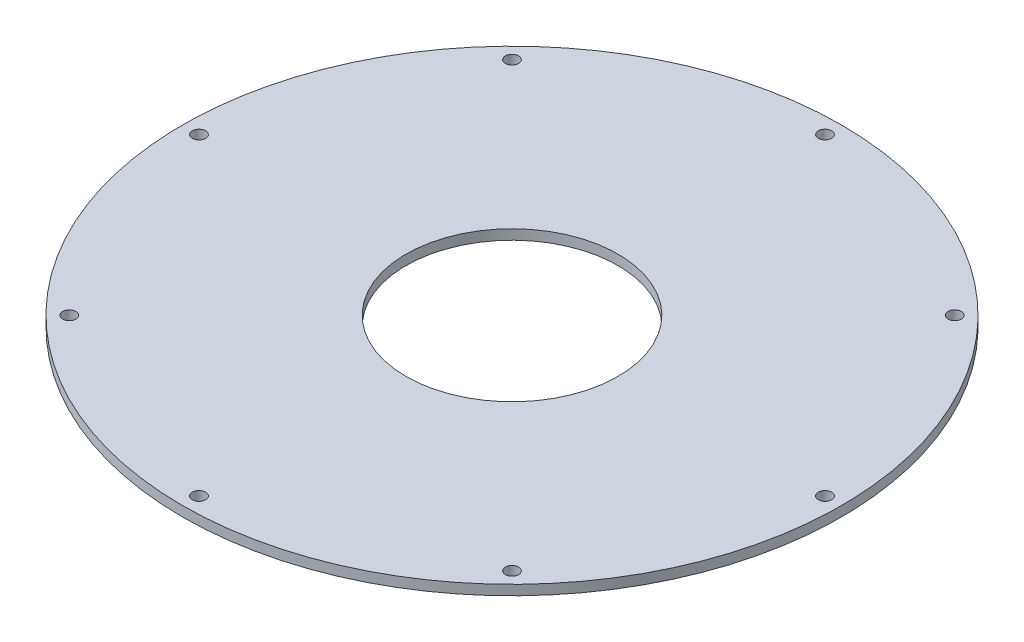
ISO-10303-21;
HEADER;
FILE_DESCRIPTION(('STEP AP214'),'2;1');
FILE_NAME('part.step','',(''),(''),'','','');
FILE_SCHEMA(('AUTOMOTIVE_DESIGN { 1 0 10303 214 1 1 1 1 }'));
ENDSEC;
DATA;
#1=APPLICATION_CONTEXT('core data for automotive mechanical design processes');
#2=APPLICATION_PROTOCOL_DEFINITION('international standard','automotive_design',2000,#1);
#3=PRODUCT_CONTEXT('',#1,'mechanical');
#4=PRODUCT('Part','Part','',(#3));
#5=PRODUCT_RELATED_PRODUCT_CATEGORY('part','',(#4));
#6=PRODUCT_DEFINITION_FORMATION('','',#4);
#7=PRODUCT_DEFINITION_CONTEXT('part definition',#1,'design');
#8=PRODUCT_DEFINITION('design','',#6,#7);
#9=PRODUCT_DEFINITION_SHAPE('','',#8);
#10=(LENGTH_UNIT() NAMED_UNIT(*) SI_UNIT(.MILLI.,.METRE.));
#11=(NAMED_UNIT(*) PLANE_ANGLE_UNIT() SI_UNIT($,.RADIAN.));
#12=(NAMED_UNIT(*) SI_UNIT($,.STERADIAN.) SOLID_ANGLE_UNIT());
#13=UNCERTAINTY_MEASURE_WITH_UNIT(LENGTH_MEASURE(1.E-05),#10,'distance_accuracy_value','');
#14=(GEOMETRIC_REPRESENTATION_CONTEXT(3) GLOBAL_UNCERTAINTY_ASSIGNED_CONTEXT((#13)) GLOBAL_UNIT_ASSIGNED_CONTEXT((#10,
#11,#12)) REPRESENTATION_CONTEXT('',''));
#15=CARTESIAN_POINT('',(0.,0.,0.));
#16=DIRECTION('',(0.,0.,1.));
#17=DIRECTION('',(1.,0.,0.));
#18=AXIS2_PLACEMENT_3D('',#15,#16,#17);
#19=CARTESIAN_POINT('',(0.,1.5,0.));
#20=DIRECTION('',(0.,1.,0.));
#21=DIRECTION('',(0.,0.,1.));
#22=AXIS2_PLACEMENT_3D('',#19,#20,#21);
#23=PLANE('',#22);
#24=CARTESIAN_POINT('',(-94.5,1.5,3.29944986520676E-13));
#25=DIRECTION('',(0.,1.,0.));
#26=DIRECTION('',(1.,0.,0.));
#27=AXIS2_PLACEMENT_3D('',#24,#25,#26);
#28=CIRCLE('',#27,2.);
#29=CARTESIAN_POINT('',(-92.5,1.5,3.2296202384299E-13));
#30=VERTEX_POINT('',#29);
#31=EDGE_CURVE('E85',#30,#30,#28,.T.);
#32=ORIENTED_EDGE('',*,*,#31,.F.);
#33=EDGE_LOOP('',(#32));
#34=FACE_BOUND('',#33,.T.);
#35=CARTESIAN_POINT('',(-66.8215908221284,1.5,66.8215908221291));
#36=DIRECTION('',(0.,1.,0.));
#37=DIRECTION('',(0.707106781186544,0.,-0.707106781186551));
#38=AXIS2_PLACEMENT_3D('',#35,#36,#37);
#39=CIRCLE('',#38,2.);
#40=CARTESIAN_POINT('',(-65.4073772597553,1.5,65.407377259756));
#41=VERTEX_POINT('',#40);
#42=EDGE_CURVE('E79',#41,#41,#39,.T.);
#43=ORIENTED_EDGE('',*,*,#42,.F.);
#44=EDGE_LOOP('',(#43));
#45=FACE_BOUND('',#44,.T.);
#46=CARTESIAN_POINT('',(0.,1.5,94.5));
#47=DIRECTION('',(0.,1.,0.));
#48=DIRECTION('',(0.,0.,-1.));
#49=AXIS2_PLACEMENT_3D('',#46,#47,#48);
#50=CIRCLE('',#49,2.);
#51=CARTESIAN_POINT('',(0.,1.5,92.5));
#52=VERTEX_POINT('',#51);
#53=EDGE_CURVE('E73',#52,#52,#50,.T.);
#54=ORIENTED_EDGE('',*,*,#53,.F.);
#55=EDGE_LOOP('',(#54));
#56=FACE_BOUND('',#55,.T.);
#57=CARTESIAN_POINT('',(66.8215908221293,1.5,66.8215908221282));
#58=DIRECTION('',(0.,1.,0.));
#59=DIRECTION('',(-0.707106781186554,0.,-0.707106781186541));
#60=AXIS2_PLACEMENT_3D('',#57,#58,#59);
#61=CIRCLE('',#60,2.);
#62=CARTESIAN_POINT('',(65.4073772597562,1.5,65.4073772597551));
#63=VERTEX_POINT('',#62);
#64=EDGE_CURVE('E66',#63,#63,#61,.T.);
#65=ORIENTED_EDGE('',*,*,#64,.F.);
#66=EDGE_LOOP('',(#65));
#67=FACE_BOUND('',#66,.T.);
#68=CARTESIAN_POINT('',(94.5,1.5,-9.89834959562028E-13));
#69=DIRECTION('',(0.,1.,0.));
#70=DIRECTION('',(-1.,0.,0.));
#71=AXIS2_PLACEMENT_3D('',#68,#69,#70);
#72=CIRCLE('',#71,2.);
#73=CARTESIAN_POINT('',(92.5,1.5,-9.68886071528969E-13));
#74=VERTEX_POINT('',#73);
#75=EDGE_CURVE('E96',#74,#74,#72,.T.);
#76=ORIENTED_EDGE('',*,*,#75,.F.);
#77=EDGE_LOOP('',(#76));
#78=FACE_BOUND('',#77,.T.);
#79=CARTESIAN_POINT('',(66.8215908221279,1.5,-66.8215908221296));
#80=DIRECTION('',(0.,1.,0.));
#81=DIRECTION('',(-0.707106781186539,0.,0.707106781186556));
#82=AXIS2_PLACEMENT_3D('',#79,#80,#81);
#83=CIRCLE('',#82,2.);
#84=CARTESIAN_POINT('',(65.4073772597549,1.5,-65.4073772597564));
#85=VERTEX_POINT('',#84);
#86=EDGE_CURVE('E90',#85,#85,#83,.T.);
#87=ORIENTED_EDGE('',*,*,#86,.F.);
#88=EDGE_LOOP('',(#87));
#89=FACE_BOUND('',#88,.T.);
#90=CARTESIAN_POINT('',(-66.8215908221289,1.5,-66.8215908221286));
#91=DIRECTION('',(0.,1.,0.));
#92=DIRECTION('',(0.707106781186549,0.,0.707106781186546));
#93=AXIS2_PLACEMENT_3D('',#90,#91,#92);
#94=CIRCLE('',#93,2.);
#95=CARTESIAN_POINT('',(-65.4073772597558,1.5,-65.4073772597555));
#96=VERTEX_POINT('',#95);
#97=EDGE_CURVE('E60',#96,#96,#94,.T.);
#98=ORIENTED_EDGE('',*,*,#97,.F.);
#99=EDGE_LOOP('',(#98));
#100=FACE_BOUND('',#99,.T.);
#101=CARTESIAN_POINT('',(0.,1.5,-94.5));
#102=DIRECTION('',(0.,1.,0.));
#103=DIRECTION('',(0.,0.,1.));
#104=AXIS2_PLACEMENT_3D('',#101,#102,#103);
#105=CIRCLE('',#104,2.);
#106=CARTESIAN_POINT('',(0.,1.5,-92.5));
#107=VERTEX_POINT('',#106);
#108=EDGE_CURVE('E54',#107,#107,#105,.T.);
#109=ORIENTED_EDGE('',*,*,#108,.F.);
#110=EDGE_LOOP('',(#109));
#111=FACE_BOUND('',#110,.T.);
#112=CARTESIAN_POINT('',(0.,1.5,0.));
#113=DIRECTION('',(0.,1.,0.));
#114=DIRECTION('',(0.,0.,1.));
#115=AXIS2_PLACEMENT_3D('',#112,#113,#114);
#116=CIRCLE('',#115,99.5);
#117=CARTESIAN_POINT('',(0.,1.5,99.5));
#118=VERTEX_POINT('',#117);
#119=EDGE_CURVE('E10',#118,#118,#116,.T.);
#120=ORIENTED_EDGE('',*,*,#119,.T.);
#121=EDGE_LOOP('',(#120));
#122=FACE_BOUND('',#121,.T.);
#123=CARTESIAN_POINT('',(0.,1.5,0.));
#124=DIRECTION('',(0.,1.,0.));
#125=DIRECTION('',(0.,0.,1.));
#126=AXIS2_PLACEMENT_3D('',#123,#124,#125);
#127=CIRCLE('',#126,32.);
#128=CARTESIAN_POINT('',(0.,1.5,32.));
#129=VERTEX_POINT('',#128);
#130=EDGE_CURVE('E46',#129,#129,#127,.T.);
#131=ORIENTED_EDGE('',*,*,#130,.F.);
#132=EDGE_LOOP('',(#131));
#133=FACE_BOUND('',#132,.T.);
#134=ADVANCED_FACE('F35',(#34,#45,#56,#67,#78,#89,#100,#111,#122,#133),#23,.T.);
#135=CARTESIAN_POINT('',(0.,-1.5,0.));
#136=DIRECTION('',(0.,1.,0.));
#137=DIRECTION('',(0.,0.,1.));
#138=AXIS2_PLACEMENT_3D('',#135,#136,#137);
#139=PLANE('',#138);
#140=CARTESIAN_POINT('',(-94.5,-1.5,3.29944986520676E-13));
#141=DIRECTION('',(0.,1.,0.));
#142=DIRECTION('',(1.,0.,0.));
#143=AXIS2_PLACEMENT_3D('',#140,#141,#142);
#144=CIRCLE('',#143,2.);
#145=CARTESIAN_POINT('',(-92.5,-1.5,3.2296202384299E-13));
#146=VERTEX_POINT('',#145);
#147=EDGE_CURVE('E63',#146,#146,#144,.T.);
#148=ORIENTED_EDGE('',*,*,#147,.T.);
#149=EDGE_LOOP('',(#148));
#150=FACE_BOUND('',#149,.T.);
#151=CARTESIAN_POINT('',(-66.8215908221284,-1.5,66.8215908221291));
#152=DIRECTION('',(0.,1.,0.));
#153=DIRECTION('',(0.707106781186544,0.,-0.707106781186551));
#154=AXIS2_PLACEMENT_3D('',#151,#152,#153);
#155=CIRCLE('',#154,2.);
#156=CARTESIAN_POINT('',(-65.4073772597553,-1.5,65.407377259756));
#157=VERTEX_POINT('',#156);
#158=EDGE_CURVE('E82',#157,#157,#155,.T.);
#159=ORIENTED_EDGE('',*,*,#158,.T.);
#160=EDGE_LOOP('',(#159));
#161=FACE_BOUND('',#160,.T.);
#162=CARTESIAN_POINT('',(0.,-1.5,94.5));
#163=DIRECTION('',(0.,1.,0.));
#164=DIRECTION('',(0.,0.,-1.));
#165=AXIS2_PLACEMENT_3D('',#162,#163,#164);
#166=CIRCLE('',#165,2.);
#167=CARTESIAN_POINT('',(0.,-1.5,92.5));
#168=VERTEX_POINT('',#167);
#169=EDGE_CURVE('E76',#168,#168,#166,.T.);
#170=ORIENTED_EDGE('',*,*,#169,.T.);
#171=EDGE_LOOP('',(#170));
#172=FACE_BOUND('',#171,.T.);
#173=CARTESIAN_POINT('',(66.8215908221293,-1.5,66.8215908221282));
#174=DIRECTION('',(0.,1.,0.));
#175=DIRECTION('',(-0.707106781186554,0.,-0.707106781186541));
#176=AXIS2_PLACEMENT_3D('',#173,#174,#175);
#177=CIRCLE('',#176,2.);
#178=CARTESIAN_POINT('',(65.4073772597562,-1.5,65.4073772597551));
#179=VERTEX_POINT('',#178);
#180=EDGE_CURVE('E69',#179,#179,#177,.T.);
#181=ORIENTED_EDGE('',*,*,#180,.T.);
#182=EDGE_LOOP('',(#181));
#183=FACE_BOUND('',#182,.T.);
#184=CARTESIAN_POINT('',(94.5,-1.5,-9.89834959562028E-13));
#185=DIRECTION('',(0.,1.,0.));
#186=DIRECTION('',(-1.,0.,0.));
#187=AXIS2_PLACEMENT_3D('',#184,#185,#186);
#188=CIRCLE('',#187,2.);
#189=CARTESIAN_POINT('',(92.5,-1.5,-9.68886071528969E-13));
#190=VERTEX_POINT('',#189);
#191=EDGE_CURVE('E70',#190,#190,#188,.T.);
#192=ORIENTED_EDGE('',*,*,#191,.T.);
#193=EDGE_LOOP('',(#192));
#194=FACE_BOUND('',#193,.T.);
#195=CARTESIAN_POINT('',(66.8215908221279,-1.5,-66.8215908221296));
#196=DIRECTION('',(0.,1.,0.));
#197=DIRECTION('',(-0.707106781186539,0.,0.707106781186556));
#198=AXIS2_PLACEMENT_3D('',#195,#196,#197);
#199=CIRCLE('',#198,2.);
#200=CARTESIAN_POINT('',(65.4073772597549,-1.5,-65.4073772597564));
#201=VERTEX_POINT('',#200);
#202=EDGE_CURVE('E93',#201,#201,#199,.T.);
#203=ORIENTED_EDGE('',*,*,#202,.T.);
#204=EDGE_LOOP('',(#203));
#205=FACE_BOUND('',#204,.T.);
#206=CARTESIAN_POINT('',(-66.8215908221289,-1.5,-66.8215908221286));
#207=DIRECTION('',(0.,1.,0.));
#208=DIRECTION('',(0.707106781186549,0.,0.707106781186546));
#209=AXIS2_PLACEMENT_3D('',#206,#207,#208);
#210=CIRCLE('',#209,2.);
#211=CARTESIAN_POINT('',(-65.4073772597558,-1.5,-65.4073772597555));
#212=VERTEX_POINT('',#211);
#213=EDGE_CURVE('E57',#212,#212,#210,.T.);
#214=ORIENTED_EDGE('',*,*,#213,.T.);
#215=EDGE_LOOP('',(#214));
#216=FACE_BOUND('',#215,.T.);
#217=CARTESIAN_POINT('',(0.,-1.5,-94.5));
#218=DIRECTION('',(0.,1.,0.));
#219=DIRECTION('',(0.,0.,1.));
#220=AXIS2_PLACEMENT_3D('',#217,#218,#219);
#221=CIRCLE('',#220,2.);
#222=CARTESIAN_POINT('',(0.,-1.5,-92.5));
#223=VERTEX_POINT('',#222);
#224=EDGE_CURVE('E51',#223,#223,#221,.T.);
#225=ORIENTED_EDGE('',*,*,#224,.T.);
#226=EDGE_LOOP('',(#225));
#227=FACE_BOUND('',#226,.T.);
#228=CARTESIAN_POINT('',(0.,-1.5,0.));
#229=DIRECTION('',(0.,1.,0.));
#230=DIRECTION('',(0.,0.,1.));
#231=AXIS2_PLACEMENT_3D('',#228,#229,#230);
#232=CIRCLE('',#231,99.5);
#233=CARTESIAN_POINT('',(0.,-1.5,99.5));
#234=VERTEX_POINT('',#233);
#235=EDGE_CURVE('E39',#234,#234,#232,.T.);
#236=ORIENTED_EDGE('',*,*,#235,.F.);
#237=EDGE_LOOP('',(#236));
#238=FACE_BOUND('',#237,.T.);
#239=CARTESIAN_POINT('',(0.,-1.5,0.));
#240=DIRECTION('',(0.,1.,0.));
#241=DIRECTION('',(0.,0.,1.));
#242=AXIS2_PLACEMENT_3D('',#239,#240,#241);
#243=CIRCLE('',#242,32.);
#244=CARTESIAN_POINT('',(0.,-1.5,32.));
#245=VERTEX_POINT('',#244);
#246=EDGE_CURVE('E48',#245,#245,#243,.T.);
#247=ORIENTED_EDGE('',*,*,#246,.T.);
#248=EDGE_LOOP('',(#247));
#249=FACE_BOUND('',#248,.T.);
#250=ADVANCED_FACE('F102',(#150,#161,#172,#183,#194,#205,#216,#227,#238,#249),#139,.F.);
#251=CARTESIAN_POINT('',(0.,1.5,0.));
#252=DIRECTION('',(0.,-1.,0.));
#253=DIRECTION('',(0.,0.,-1.));
#254=AXIS2_PLACEMENT_3D('',#251,#252,#253);
#255=CYLINDRICAL_SURFACE('',#254,99.5);
#256=ORIENTED_EDGE('',*,*,#119,.F.);
#257=EDGE_LOOP('',(#256));
#258=FACE_BOUND('',#257,.T.);
#259=ORIENTED_EDGE('',*,*,#235,.T.);
#260=EDGE_LOOP('',(#259));
#261=FACE_BOUND('',#260,.T.);
#262=ADVANCED_FACE('F37',(#258,#261),#255,.T.);
#263=CARTESIAN_POINT('',(0.,1.5,0.));
#264=DIRECTION('',(0.,-1.,0.));
#265=DIRECTION('',(0.,0.,-1.));
#266=AXIS2_PLACEMENT_3D('',#263,#264,#265);
#267=CYLINDRICAL_SURFACE('',#266,32.);
#268=ORIENTED_EDGE('',*,*,#130,.T.);
#269=EDGE_LOOP('',(#268));
#270=FACE_BOUND('',#269,.T.);
#271=ORIENTED_EDGE('',*,*,#246,.F.);
#272=EDGE_LOOP('',(#271));
#273=FACE_BOUND('',#272,.T.);
#274=ADVANCED_FACE('F125',(#270,#273),#267,.F.);
#275=CARTESIAN_POINT('',(0.,-1.5,-94.5));
#276=DIRECTION('',(0.,1.,0.));
#277=DIRECTION('',(0.,0.,1.));
#278=AXIS2_PLACEMENT_3D('',#275,#276,#277);
#279=CYLINDRICAL_SURFACE('',#278,2.);
#280=ORIENTED_EDGE('',*,*,#224,.F.);
#281=EDGE_LOOP('',(#280));
#282=FACE_BOUND('',#281,.T.);
#283=ORIENTED_EDGE('',*,*,#108,.T.);
#284=EDGE_LOOP('',(#283));
#285=FACE_BOUND('',#284,.T.);
#286=ADVANCED_FACE('F128',(#282,#285),#279,.F.);
#287=CARTESIAN_POINT('',(-66.8215908221289,-1.5,-66.8215908221286));
#288=DIRECTION('',(0.,1.,0.));
#289=DIRECTION('',(0.,0.,1.));
#290=AXIS2_PLACEMENT_3D('',#287,#288,#289);
#291=CYLINDRICAL_SURFACE('',#290,2.);
#292=ORIENTED_EDGE('',*,*,#213,.F.);
#293=EDGE_LOOP('',(#292));
#294=FACE_BOUND('',#293,.T.);
#295=ORIENTED_EDGE('',*,*,#97,.T.);
#296=EDGE_LOOP('',(#295));
#297=FACE_BOUND('',#296,.T.);
#298=ADVANCED_FACE('F142',(#294,#297),#291,.F.);
#299=CARTESIAN_POINT('',(66.8215908221279,-1.5,-66.8215908221296));
#300=DIRECTION('',(0.,1.,0.));
#301=DIRECTION('',(0.,0.,1.));
#302=AXIS2_PLACEMENT_3D('',#299,#300,#301);
#303=CYLINDRICAL_SURFACE('',#302,2.);
#304=ORIENTED_EDGE('',*,*,#202,.F.);
#305=EDGE_LOOP('',(#304));
#306=FACE_BOUND('',#305,.T.);
#307=ORIENTED_EDGE('',*,*,#86,.T.);
#308=EDGE_LOOP('',(#307));
#309=FACE_BOUND('',#308,.T.);
#310=ADVANCED_FACE('F109',(#306,#309),#303,.F.);
#311=CARTESIAN_POINT('',(94.5,-1.5,-9.89834959562028E-13));
#312=DIRECTION('',(0.,1.,0.));
#313=DIRECTION('',(0.,0.,1.));
#314=AXIS2_PLACEMENT_3D('',#311,#312,#313);
#315=CYLINDRICAL_SURFACE('',#314,2.);
#316=ORIENTED_EDGE('',*,*,#191,.F.);
#317=EDGE_LOOP('',(#316));
#318=FACE_BOUND('',#317,.T.);
#319=ORIENTED_EDGE('',*,*,#75,.T.);
#320=EDGE_LOOP('',(#319));
#321=FACE_BOUND('',#320,.T.);
#322=ADVANCED_FACE('F105',(#318,#321),#315,.F.);
#323=CARTESIAN_POINT('',(66.8215908221293,-1.5,66.8215908221282));
#324=DIRECTION('',(0.,1.,0.));
#325=DIRECTION('',(0.,0.,1.));
#326=AXIS2_PLACEMENT_3D('',#323,#324,#325);
#327=CYLINDRICAL_SURFACE('',#326,2.);
#328=ORIENTED_EDGE('',*,*,#180,.F.);
#329=EDGE_LOOP('',(#328));
#330=FACE_BOUND('',#329,.T.);
#331=ORIENTED_EDGE('',*,*,#64,.T.);
#332=EDGE_LOOP('',(#331));
#333=FACE_BOUND('',#332,.T.);
#334=ADVANCED_FACE('F108',(#330,#333),#327,.F.);
#335=CARTESIAN_POINT('',(0.,-1.5,94.5));
#336=DIRECTION('',(0.,1.,0.));
#337=DIRECTION('',(0.,0.,1.));
#338=AXIS2_PLACEMENT_3D('',#335,#336,#337);
#339=CYLINDRICAL_SURFACE('',#338,2.);
#340=ORIENTED_EDGE('',*,*,#169,.F.);
#341=EDGE_LOOP('',(#340));
#342=FACE_BOUND('',#341,.T.);
#343=ORIENTED_EDGE('',*,*,#53,.T.);
#344=EDGE_LOOP('',(#343));
#345=FACE_BOUND('',#344,.T.);
#346=ADVANCED_FACE('F149',(#342,#345),#339,.F.);
#347=CARTESIAN_POINT('',(-66.8215908221284,-1.5,66.8215908221291));
#348=DIRECTION('',(0.,1.,0.));
#349=DIRECTION('',(0.,0.,1.));
#350=AXIS2_PLACEMENT_3D('',#347,#348,#349);
#351=CYLINDRICAL_SURFACE('',#350,2.);
#352=ORIENTED_EDGE('',*,*,#158,.F.);
#353=EDGE_LOOP('',(#352));
#354=FACE_BOUND('',#353,.T.);
#355=ORIENTED_EDGE('',*,*,#42,.T.);
#356=EDGE_LOOP('',(#355));
#357=FACE_BOUND('',#356,.T.);
#358=ADVANCED_FACE('F153',(#354,#357),#351,.F.);
#359=CARTESIAN_POINT('',(-94.5,-1.5,3.29944986520676E-13));
#360=DIRECTION('',(0.,1.,0.));
#361=DIRECTION('',(0.,0.,1.));
#362=AXIS2_PLACEMENT_3D('',#359,#360,#361);
#363=CYLINDRICAL_SURFACE('',#362,2.);
#364=ORIENTED_EDGE('',*,*,#147,.F.);
#365=EDGE_LOOP('',(#364));
#366=FACE_BOUND('',#365,.T.);
#367=ORIENTED_EDGE('',*,*,#31,.T.);
#368=EDGE_LOOP('',(#367));
#369=FACE_BOUND('',#368,.T.);
#370=ADVANCED_FACE('F157',(#366,#369),#363,.F.);
#371=CLOSED_SHELL('',(#134,#250,#262,#274,#286,#298,#310,#322,#334,#346,#358,#370));
#372=MANIFOLD_SOLID_BREP('B2',#371);
#373=ADVANCED_BREP_SHAPE_REPRESENTATION('',(#18,#372),#14);
#374=SHAPE_DEFINITION_REPRESENTATION(#9,#373);
ENDSEC;
END-ISO-10303-21;
